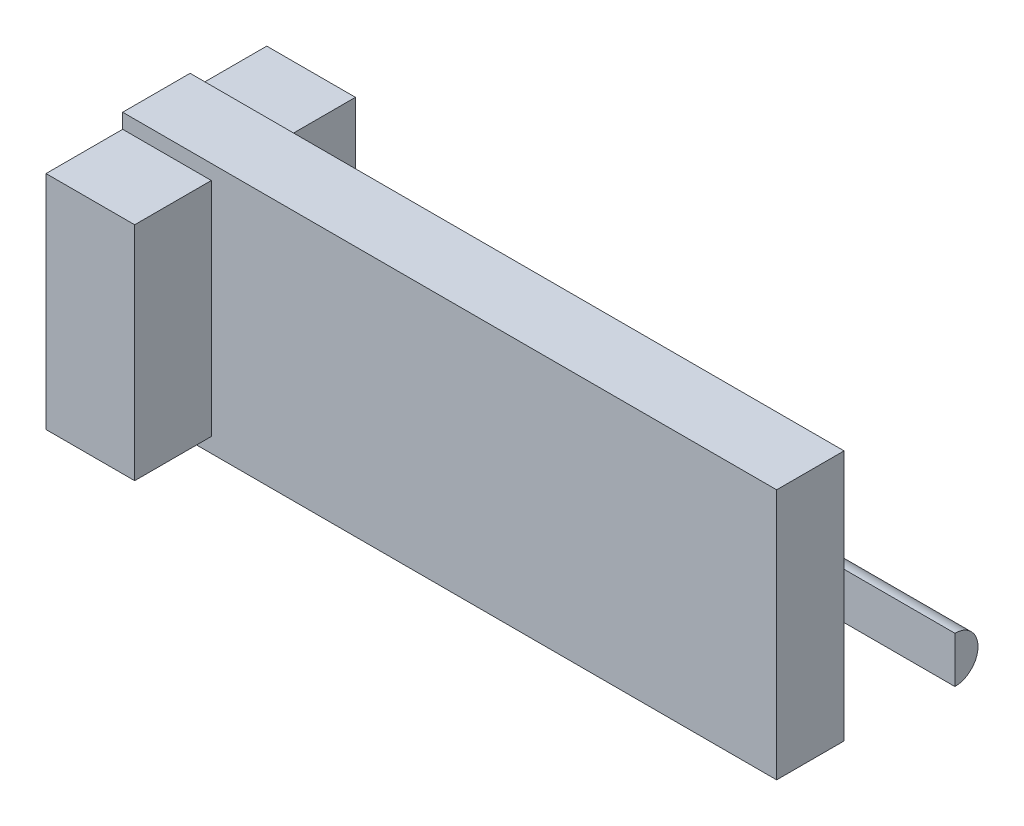
ISO-10303-21;
HEADER;
FILE_DESCRIPTION(('STEP AP214'),'2;1');
FILE_NAME('part.step','',(''),(''),'','','');
FILE_SCHEMA(('AUTOMOTIVE_DESIGN { 1 0 10303 214 1 1 1 1 }'));
ENDSEC;
DATA;
#1=APPLICATION_CONTEXT('core data for automotive mechanical design processes');
#2=APPLICATION_PROTOCOL_DEFINITION('international standard','automotive_design',2000,#1);
#3=PRODUCT_CONTEXT('',#1,'mechanical');
#4=PRODUCT('Part','Part','',(#3));
#5=PRODUCT_RELATED_PRODUCT_CATEGORY('part','',(#4));
#6=PRODUCT_DEFINITION_FORMATION('','',#4);
#7=PRODUCT_DEFINITION_CONTEXT('part definition',#1,'design');
#8=PRODUCT_DEFINITION('design','',#6,#7);
#9=PRODUCT_DEFINITION_SHAPE('','',#8);
#10=(LENGTH_UNIT() NAMED_UNIT(*) SI_UNIT(.MILLI.,.METRE.));
#11=(NAMED_UNIT(*) PLANE_ANGLE_UNIT() SI_UNIT($,.RADIAN.));
#12=(NAMED_UNIT(*) SI_UNIT($,.STERADIAN.) SOLID_ANGLE_UNIT());
#13=UNCERTAINTY_MEASURE_WITH_UNIT(LENGTH_MEASURE(1.E-05),#10,'distance_accuracy_value','');
#14=(GEOMETRIC_REPRESENTATION_CONTEXT(3) GLOBAL_UNCERTAINTY_ASSIGNED_CONTEXT((#13)) GLOBAL_UNIT_ASSIGNED_CONTEXT((#10,
#11,#12)) REPRESENTATION_CONTEXT('',''));
#15=CARTESIAN_POINT('',(0.,0.,0.));
#16=DIRECTION('',(0.,0.,1.));
#17=DIRECTION('',(1.,0.,0.));
#18=AXIS2_PLACEMENT_3D('',#15,#16,#17);
#19=CARTESIAN_POINT('',(0.,0.,-1.825));
#20=DIRECTION('',(0.,0.,1.));
#21=DIRECTION('',(1.,0.,0.));
#22=AXIS2_PLACEMENT_3D('',#19,#20,#21);
#23=PLANE('',#22);
#24=DIRECTION('',(0.,1.,0.));
#25=VECTOR('',#24,1.);
#26=CARTESIAN_POINT('',(11.7,0.,-1.825));
#27=LINE('',#26,#25);
#28=CARTESIAN_POINT('',(11.7,-1.25,-1.82499999999999));
#29=VERTEX_POINT('',#28);
#30=CARTESIAN_POINT('',(11.7,1.25,-1.825));
#31=VERTEX_POINT('',#30);
#32=EDGE_CURVE('E152',#29,#31,#27,.T.);
#33=ORIENTED_EDGE('',*,*,#32,.F.);
#34=DIRECTION('',(-1.,0.,0.));
#35=VECTOR('',#34,1.);
#36=CARTESIAN_POINT('',(0.,-1.25,-1.82499999999999));
#37=LINE('',#36,#35);
#38=CARTESIAN_POINT('',(17.7,-1.25,-1.82499999999999));
#39=VERTEX_POINT('',#38);
#40=EDGE_CURVE('E165',#39,#29,#37,.T.);
#41=ORIENTED_EDGE('',*,*,#40,.F.);
#42=DIRECTION('',(0.,1.,0.));
#43=VECTOR('',#42,1.);
#44=CARTESIAN_POINT('',(17.7,6.8,-1.825));
#45=LINE('',#44,#43);
#46=CARTESIAN_POINT('',(17.7,-6.8,-1.825));
#47=VERTEX_POINT('',#46);
#48=EDGE_CURVE('E240',#47,#39,#45,.T.);
#49=ORIENTED_EDGE('',*,*,#48,.F.);
#50=DIRECTION('',(1.,0.,0.));
#51=VECTOR('',#50,1.);
#52=CARTESIAN_POINT('',(-17.7,-6.8,-1.825));
#53=LINE('',#52,#51);
#54=CARTESIAN_POINT('',(-17.7,-6.8,-1.825));
#55=VERTEX_POINT('',#54);
#56=EDGE_CURVE('E232',#55,#47,#53,.T.);
#57=ORIENTED_EDGE('',*,*,#56,.F.);
#58=DIRECTION('',(0.,-1.,0.));
#59=VECTOR('',#58,1.);
#60=CARTESIAN_POINT('',(-17.7,6.8,-1.825));
#61=LINE('',#60,#59);
#62=CARTESIAN_POINT('',(-17.7,-6.,-1.825));
#63=VERTEX_POINT('',#62);
#64=EDGE_CURVE('E246',#63,#55,#61,.T.);
#65=ORIENTED_EDGE('',*,*,#64,.F.);
#66=DIRECTION('',(-1.,0.,0.));
#67=VECTOR('',#66,1.);
#68=CARTESIAN_POINT('',(-12.9,-6.,-1.825));
#69=LINE('',#68,#67);
#70=CARTESIAN_POINT('',(-12.9,-6.,-1.825));
#71=VERTEX_POINT('',#70);
#72=EDGE_CURVE('E63',#71,#63,#69,.T.);
#73=ORIENTED_EDGE('',*,*,#72,.F.);
#74=DIRECTION('',(0.,-1.,0.));
#75=VECTOR('',#74,1.);
#76=CARTESIAN_POINT('',(-12.9,6.,-1.825));
#77=LINE('',#76,#75);
#78=CARTESIAN_POINT('',(-12.9,6.,-1.825));
#79=VERTEX_POINT('',#78);
#80=EDGE_CURVE('E183',#79,#71,#77,.T.);
#81=ORIENTED_EDGE('',*,*,#80,.F.);
#82=DIRECTION('',(1.,0.,0.));
#83=VECTOR('',#82,1.);
#84=CARTESIAN_POINT('',(-17.7,6.,-1.825));
#85=LINE('',#84,#83);
#86=CARTESIAN_POINT('',(-17.7,6.,-1.825));
#87=VERTEX_POINT('',#86);
#88=EDGE_CURVE('E157',#87,#79,#85,.T.);
#89=ORIENTED_EDGE('',*,*,#88,.F.);
#90=CARTESIAN_POINT('',(-17.7,6.8,-1.825));
#91=VERTEX_POINT('',#90);
#92=EDGE_CURVE('E247',#91,#87,#61,.T.);
#93=ORIENTED_EDGE('',*,*,#92,.F.);
#94=DIRECTION('',(-1.,0.,0.));
#95=VECTOR('',#94,1.);
#96=CARTESIAN_POINT('',(-17.7,6.8,-1.825));
#97=LINE('',#96,#95);
#98=CARTESIAN_POINT('',(17.7,6.8,-1.825));
#99=VERTEX_POINT('',#98);
#100=EDGE_CURVE('E243',#99,#91,#97,.T.);
#101=ORIENTED_EDGE('',*,*,#100,.F.);
#102=CARTESIAN_POINT('',(17.7,1.25,-1.825));
#103=VERTEX_POINT('',#102);
#104=EDGE_CURVE('E227',#103,#99,#45,.T.);
#105=ORIENTED_EDGE('',*,*,#104,.F.);
#106=DIRECTION('',(-1.,0.,0.));
#107=VECTOR('',#106,1.);
#108=CARTESIAN_POINT('',(0.,1.25,-1.825));
#109=LINE('',#108,#107);
#110=EDGE_CURVE('E163',#103,#31,#109,.T.);
#111=ORIENTED_EDGE('',*,*,#110,.T.);
#112=EDGE_LOOP('',(#33,#41,#49,#57,#65,#73,#81,#89,#93,#101,#105,#111));
#113=FACE_BOUND('',#112,.T.);
#114=ADVANCED_FACE('F40',(#113),#23,.F.);
#115=CARTESIAN_POINT('',(17.7,6.8,1.825));
#116=DIRECTION('',(-1.,0.,0.));
#117=DIRECTION('',(0.,0.,1.));
#118=AXIS2_PLACEMENT_3D('',#115,#116,#117);
#119=PLANE('',#118);
#120=ORIENTED_EDGE('',*,*,#48,.T.);
#121=EDGE_CURVE('E244',#39,#103,#45,.T.);
#122=ORIENTED_EDGE('',*,*,#121,.T.);
#123=ORIENTED_EDGE('',*,*,#104,.T.);
#124=DIRECTION('',(0.,0.,-1.));
#125=VECTOR('',#124,1.);
#126=CARTESIAN_POINT('',(17.7,6.8,1.825));
#127=LINE('',#126,#125);
#128=CARTESIAN_POINT('',(17.7,6.8,1.825));
#129=VERTEX_POINT('',#128);
#130=EDGE_CURVE('E11',#129,#99,#127,.T.);
#131=ORIENTED_EDGE('',*,*,#130,.F.);
#132=DIRECTION('',(0.,1.,0.));
#133=VECTOR('',#132,1.);
#134=CARTESIAN_POINT('',(17.7,6.8,1.825));
#135=LINE('',#134,#133);
#136=CARTESIAN_POINT('',(17.7,-6.8,1.825));
#137=VERTEX_POINT('',#136);
#138=EDGE_CURVE('E228',#137,#129,#135,.T.);
#139=ORIENTED_EDGE('',*,*,#138,.F.);
#140=DIRECTION('',(0.,0.,-1.));
#141=VECTOR('',#140,1.);
#142=CARTESIAN_POINT('',(17.7,-6.8,1.825));
#143=LINE('',#142,#141);
#144=EDGE_CURVE('E239',#137,#47,#143,.T.);
#145=ORIENTED_EDGE('',*,*,#144,.T.);
#146=EDGE_LOOP('',(#120,#122,#123,#131,#139,#145));
#147=FACE_BOUND('',#146,.T.);
#148=ADVANCED_FACE('F42',(#147),#119,.F.);
#149=CARTESIAN_POINT('',(-17.7,6.8,1.825));
#150=DIRECTION('',(0.,-1.,0.));
#151=DIRECTION('',(0.,0.,-1.));
#152=AXIS2_PLACEMENT_3D('',#149,#150,#151);
#153=PLANE('',#152);
#154=ORIENTED_EDGE('',*,*,#100,.T.);
#155=DIRECTION('',(0.,0.,-1.));
#156=VECTOR('',#155,1.);
#157=CARTESIAN_POINT('',(-17.7,6.8,1.825));
#158=LINE('',#157,#156);
#159=CARTESIAN_POINT('',(-17.7,6.8,1.825));
#160=VERTEX_POINT('',#159);
#161=EDGE_CURVE('E48',#160,#91,#158,.T.);
#162=ORIENTED_EDGE('',*,*,#161,.F.);
#163=DIRECTION('',(-1.,0.,0.));
#164=VECTOR('',#163,1.);
#165=CARTESIAN_POINT('',(-17.7,6.8,1.825));
#166=LINE('',#165,#164);
#167=EDGE_CURVE('E231',#129,#160,#166,.T.);
#168=ORIENTED_EDGE('',*,*,#167,.F.);
#169=ORIENTED_EDGE('',*,*,#130,.T.);
#170=EDGE_LOOP('',(#154,#162,#168,#169));
#171=FACE_BOUND('',#170,.T.);
#172=ADVANCED_FACE('F293',(#171),#153,.F.);
#173=CARTESIAN_POINT('',(-17.7,6.8,1.825));
#174=DIRECTION('',(1.,0.,0.));
#175=DIRECTION('',(0.,0.,-1.));
#176=AXIS2_PLACEMENT_3D('',#173,#174,#175);
#177=PLANE('',#176);
#178=ORIENTED_EDGE('',*,*,#92,.T.);
#179=DIRECTION('',(0.,0.,1.));
#180=VECTOR('',#179,1.);
#181=CARTESIAN_POINT('',(-17.7,6.,-5.975));
#182=LINE('',#181,#180);
#183=CARTESIAN_POINT('',(-17.7,6.,-5.975));
#184=VERTEX_POINT('',#183);
#185=EDGE_CURVE('E194',#184,#87,#182,.T.);
#186=ORIENTED_EDGE('',*,*,#185,.F.);
#187=DIRECTION('',(0.,1.,0.));
#188=VECTOR('',#187,1.);
#189=CARTESIAN_POINT('',(-17.7,-6.,-5.975));
#190=LINE('',#189,#188);
#191=CARTESIAN_POINT('',(-17.7,-6.,-5.975));
#192=VERTEX_POINT('',#191);
#193=EDGE_CURVE('E171',#192,#184,#190,.T.);
#194=ORIENTED_EDGE('',*,*,#193,.F.);
#195=DIRECTION('',(0.,0.,1.));
#196=VECTOR('',#195,1.);
#197=CARTESIAN_POINT('',(-17.7,-6.,-5.975));
#198=LINE('',#197,#196);
#199=EDGE_CURVE('E180',#192,#63,#198,.T.);
#200=ORIENTED_EDGE('',*,*,#199,.T.);
#201=ORIENTED_EDGE('',*,*,#64,.T.);
#202=DIRECTION('',(0.,0.,-1.));
#203=VECTOR('',#202,1.);
#204=CARTESIAN_POINT('',(-17.7,-6.8,1.825));
#205=LINE('',#204,#203);
#206=CARTESIAN_POINT('',(-17.7,-6.8,1.825));
#207=VERTEX_POINT('',#206);
#208=EDGE_CURVE('E253',#207,#55,#205,.T.);
#209=ORIENTED_EDGE('',*,*,#208,.F.);
#210=DIRECTION('',(0.,-1.,0.));
#211=VECTOR('',#210,1.);
#212=CARTESIAN_POINT('',(-17.7,6.8,1.825));
#213=LINE('',#212,#211);
#214=CARTESIAN_POINT('',(-17.7,-6.,1.825));
#215=VERTEX_POINT('',#214);
#216=EDGE_CURVE('E234',#215,#207,#213,.T.);
#217=ORIENTED_EDGE('',*,*,#216,.F.);
#218=DIRECTION('',(0.,0.,-1.));
#219=VECTOR('',#218,1.);
#220=CARTESIAN_POINT('',(-17.7,-6.,5.975));
#221=LINE('',#220,#219);
#222=CARTESIAN_POINT('',(-17.7,-6.,5.975));
#223=VERTEX_POINT('',#222);
#224=EDGE_CURVE('E218',#223,#215,#221,.T.);
#225=ORIENTED_EDGE('',*,*,#224,.F.);
#226=DIRECTION('',(0.,-1.,0.));
#227=VECTOR('',#226,1.);
#228=CARTESIAN_POINT('',(-17.7,6.,5.975));
#229=LINE('',#228,#227);
#230=CARTESIAN_POINT('',(-17.7,6.,5.975));
#231=VERTEX_POINT('',#230);
#232=EDGE_CURVE('E204',#231,#223,#229,.T.);
#233=ORIENTED_EDGE('',*,*,#232,.F.);
#234=DIRECTION('',(0.,0.,-1.));
#235=VECTOR('',#234,1.);
#236=CARTESIAN_POINT('',(-17.7,6.,5.975));
#237=LINE('',#236,#235);
#238=CARTESIAN_POINT('',(-17.7,6.,1.825));
#239=VERTEX_POINT('',#238);
#240=EDGE_CURVE('E221',#231,#239,#237,.T.);
#241=ORIENTED_EDGE('',*,*,#240,.T.);
#242=EDGE_CURVE('E235',#160,#239,#213,.T.);
#243=ORIENTED_EDGE('',*,*,#242,.F.);
#244=ORIENTED_EDGE('',*,*,#161,.T.);
#245=EDGE_LOOP('',(#178,#186,#194,#200,#201,#209,#217,#225,#233,#241,#243,#244));
#246=FACE_BOUND('',#245,.T.);
#247=ADVANCED_FACE('F260',(#246),#177,.F.);
#248=CARTESIAN_POINT('',(-17.7,-6.8,1.825));
#249=DIRECTION('',(0.,1.,0.));
#250=DIRECTION('',(0.,0.,1.));
#251=AXIS2_PLACEMENT_3D('',#248,#249,#250);
#252=PLANE('',#251);
#253=ORIENTED_EDGE('',*,*,#56,.T.);
#254=ORIENTED_EDGE('',*,*,#144,.F.);
#255=DIRECTION('',(1.,0.,0.));
#256=VECTOR('',#255,1.);
#257=CARTESIAN_POINT('',(-17.7,-6.8,1.825));
#258=LINE('',#257,#256);
#259=EDGE_CURVE('E237',#207,#137,#258,.T.);
#260=ORIENTED_EDGE('',*,*,#259,.F.);
#261=ORIENTED_EDGE('',*,*,#208,.T.);
#262=EDGE_LOOP('',(#253,#254,#260,#261));
#263=FACE_BOUND('',#262,.T.);
#264=ADVANCED_FACE('F299',(#263),#252,.F.);
#265=CARTESIAN_POINT('',(0.,0.,1.825));
#266=DIRECTION('',(0.,0.,1.));
#267=DIRECTION('',(1.,0.,0.));
#268=AXIS2_PLACEMENT_3D('',#265,#266,#267);
#269=PLANE('',#268);
#270=DIRECTION('',(1.,0.,0.));
#271=VECTOR('',#270,1.);
#272=CARTESIAN_POINT('',(-17.7,-6.,1.825));
#273=LINE('',#272,#271);
#274=CARTESIAN_POINT('',(-12.9,-6.,1.825));
#275=VERTEX_POINT('',#274);
#276=EDGE_CURVE('E202',#215,#275,#273,.T.);
#277=ORIENTED_EDGE('',*,*,#276,.F.);
#278=ORIENTED_EDGE('',*,*,#216,.T.);
#279=ORIENTED_EDGE('',*,*,#259,.T.);
#280=ORIENTED_EDGE('',*,*,#138,.T.);
#281=ORIENTED_EDGE('',*,*,#167,.T.);
#282=ORIENTED_EDGE('',*,*,#242,.T.);
#283=DIRECTION('',(-1.,0.,0.));
#284=VECTOR('',#283,1.);
#285=CARTESIAN_POINT('',(-17.7,6.,1.825));
#286=LINE('',#285,#284);
#287=CARTESIAN_POINT('',(-12.9,6.,1.825));
#288=VERTEX_POINT('',#287);
#289=EDGE_CURVE('E211',#288,#239,#286,.T.);
#290=ORIENTED_EDGE('',*,*,#289,.F.);
#291=DIRECTION('',(0.,1.,0.));
#292=VECTOR('',#291,1.);
#293=CARTESIAN_POINT('',(-12.9,6.,1.825));
#294=LINE('',#293,#292);
#295=EDGE_CURVE('E197',#275,#288,#294,.T.);
#296=ORIENTED_EDGE('',*,*,#295,.F.);
#297=EDGE_LOOP('',(#277,#278,#279,#280,#281,#282,#290,#296));
#298=FACE_BOUND('',#297,.T.);
#299=ADVANCED_FACE('F297',(#298),#269,.T.);
#300=CARTESIAN_POINT('',(-12.9,6.,5.975));
#301=DIRECTION('',(-1.,0.,0.));
#302=DIRECTION('',(0.,-1.,0.));
#303=AXIS2_PLACEMENT_3D('',#300,#301,#302);
#304=PLANE('',#303);
#305=ORIENTED_EDGE('',*,*,#295,.T.);
#306=DIRECTION('',(0.,0.,-1.));
#307=VECTOR('',#306,1.);
#308=CARTESIAN_POINT('',(-12.9,6.,5.975));
#309=LINE('',#308,#307);
#310=CARTESIAN_POINT('',(-12.9,6.,5.975));
#311=VERTEX_POINT('',#310);
#312=EDGE_CURVE('E224',#311,#288,#309,.T.);
#313=ORIENTED_EDGE('',*,*,#312,.F.);
#314=DIRECTION('',(0.,1.,0.));
#315=VECTOR('',#314,1.);
#316=CARTESIAN_POINT('',(-12.9,6.,5.975));
#317=LINE('',#316,#315);
#318=CARTESIAN_POINT('',(-12.9,-6.,5.975));
#319=VERTEX_POINT('',#318);
#320=EDGE_CURVE('E198',#319,#311,#317,.T.);
#321=ORIENTED_EDGE('',*,*,#320,.F.);
#322=DIRECTION('',(0.,0.,-1.));
#323=VECTOR('',#322,1.);
#324=CARTESIAN_POINT('',(-12.9,-6.,5.975));
#325=LINE('',#324,#323);
#326=EDGE_CURVE('E208',#319,#275,#325,.T.);
#327=ORIENTED_EDGE('',*,*,#326,.T.);
#328=EDGE_LOOP('',(#305,#313,#321,#327));
#329=FACE_BOUND('',#328,.T.);
#330=ADVANCED_FACE('F418',(#329),#304,.F.);
#331=CARTESIAN_POINT('',(-17.7,6.,5.975));
#332=DIRECTION('',(0.,-1.,0.));
#333=DIRECTION('',(0.,0.,-1.));
#334=AXIS2_PLACEMENT_3D('',#331,#332,#333);
#335=PLANE('',#334);
#336=ORIENTED_EDGE('',*,*,#289,.T.);
#337=ORIENTED_EDGE('',*,*,#240,.F.);
#338=DIRECTION('',(-1.,0.,0.));
#339=VECTOR('',#338,1.);
#340=CARTESIAN_POINT('',(-17.7,6.,5.975));
#341=LINE('',#340,#339);
#342=EDGE_CURVE('E201',#311,#231,#341,.T.);
#343=ORIENTED_EDGE('',*,*,#342,.F.);
#344=ORIENTED_EDGE('',*,*,#312,.T.);
#345=EDGE_LOOP('',(#336,#337,#343,#344));
#346=FACE_BOUND('',#345,.T.);
#347=ADVANCED_FACE('F410',(#346),#335,.F.);
#348=CARTESIAN_POINT('',(-17.7,-6.,5.975));
#349=DIRECTION('',(0.,1.,0.));
#350=DIRECTION('',(0.,0.,1.));
#351=AXIS2_PLACEMENT_3D('',#348,#349,#350);
#352=PLANE('',#351);
#353=ORIENTED_EDGE('',*,*,#276,.T.);
#354=ORIENTED_EDGE('',*,*,#326,.F.);
#355=DIRECTION('',(1.,0.,0.));
#356=VECTOR('',#355,1.);
#357=CARTESIAN_POINT('',(-17.7,-6.,5.975));
#358=LINE('',#357,#356);
#359=EDGE_CURVE('E206',#223,#319,#358,.T.);
#360=ORIENTED_EDGE('',*,*,#359,.F.);
#361=ORIENTED_EDGE('',*,*,#224,.T.);
#362=EDGE_LOOP('',(#353,#354,#360,#361));
#363=FACE_BOUND('',#362,.T.);
#364=ADVANCED_FACE('F401',(#363),#352,.F.);
#365=CARTESIAN_POINT('',(0.,0.,5.975));
#366=DIRECTION('',(0.,0.,1.));
#367=DIRECTION('',(1.,0.,0.));
#368=AXIS2_PLACEMENT_3D('',#365,#366,#367);
#369=PLANE('',#368);
#370=ORIENTED_EDGE('',*,*,#320,.T.);
#371=ORIENTED_EDGE('',*,*,#342,.T.);
#372=ORIENTED_EDGE('',*,*,#232,.T.);
#373=ORIENTED_EDGE('',*,*,#359,.T.);
#374=EDGE_LOOP('',(#370,#371,#372,#373));
#375=FACE_BOUND('',#374,.T.);
#376=ADVANCED_FACE('F378',(#375),#369,.T.);
#377=CARTESIAN_POINT('',(-17.7,6.,-5.975));
#378=DIRECTION('',(0.,-1.,0.));
#379=DIRECTION('',(0.,0.,-1.));
#380=AXIS2_PLACEMENT_3D('',#377,#378,#379);
#381=PLANE('',#380);
#382=ORIENTED_EDGE('',*,*,#88,.T.);
#383=DIRECTION('',(0.,0.,1.));
#384=VECTOR('',#383,1.);
#385=CARTESIAN_POINT('',(-12.9,6.,-5.975));
#386=LINE('',#385,#384);
#387=CARTESIAN_POINT('',(-12.9,6.,-5.975));
#388=VERTEX_POINT('',#387);
#389=EDGE_CURVE('E191',#388,#79,#386,.T.);
#390=ORIENTED_EDGE('',*,*,#389,.F.);
#391=DIRECTION('',(1.,0.,0.));
#392=VECTOR('',#391,1.);
#393=CARTESIAN_POINT('',(-17.7,6.,-5.975));
#394=LINE('',#393,#392);
#395=EDGE_CURVE('E174',#184,#388,#394,.T.);
#396=ORIENTED_EDGE('',*,*,#395,.F.);
#397=ORIENTED_EDGE('',*,*,#185,.T.);
#398=EDGE_LOOP('',(#382,#390,#396,#397));
#399=FACE_BOUND('',#398,.T.);
#400=ADVANCED_FACE('F267',(#399),#381,.F.);
#401=CARTESIAN_POINT('',(-12.9,6.,-5.975));
#402=DIRECTION('',(-1.,0.,0.));
#403=DIRECTION('',(0.,-1.,0.));
#404=AXIS2_PLACEMENT_3D('',#401,#402,#403);
#405=PLANE('',#404);
#406=ORIENTED_EDGE('',*,*,#80,.T.);
#407=DIRECTION('',(0.,0.,1.));
#408=VECTOR('',#407,1.);
#409=CARTESIAN_POINT('',(-12.9,-6.,-5.975));
#410=LINE('',#409,#408);
#411=CARTESIAN_POINT('',(-12.9,-6.,-5.975));
#412=VERTEX_POINT('',#411);
#413=EDGE_CURVE('E188',#412,#71,#410,.T.);
#414=ORIENTED_EDGE('',*,*,#413,.F.);
#415=DIRECTION('',(0.,-1.,0.));
#416=VECTOR('',#415,1.);
#417=CARTESIAN_POINT('',(-12.9,6.,-5.975));
#418=LINE('',#417,#416);
#419=EDGE_CURVE('E176',#388,#412,#418,.T.);
#420=ORIENTED_EDGE('',*,*,#419,.F.);
#421=ORIENTED_EDGE('',*,*,#389,.T.);
#422=EDGE_LOOP('',(#406,#414,#420,#421));
#423=FACE_BOUND('',#422,.T.);
#424=ADVANCED_FACE('F270',(#423),#405,.F.);
#425=CARTESIAN_POINT('',(-12.9,-6.,-5.975));
#426=DIRECTION('',(0.,1.,0.));
#427=DIRECTION('',(0.,0.,1.));
#428=AXIS2_PLACEMENT_3D('',#425,#426,#427);
#429=PLANE('',#428);
#430=ORIENTED_EDGE('',*,*,#72,.T.);
#431=ORIENTED_EDGE('',*,*,#199,.F.);
#432=DIRECTION('',(-1.,0.,0.));
#433=VECTOR('',#432,1.);
#434=CARTESIAN_POINT('',(-12.9,-6.,-5.975));
#435=LINE('',#434,#433);
#436=EDGE_CURVE('E178',#412,#192,#435,.T.);
#437=ORIENTED_EDGE('',*,*,#436,.F.);
#438=ORIENTED_EDGE('',*,*,#413,.T.);
#439=EDGE_LOOP('',(#430,#431,#437,#438));
#440=FACE_BOUND('',#439,.T.);
#441=ADVANCED_FACE('F279',(#440),#429,.F.);
#442=CARTESIAN_POINT('',(0.,0.,-5.975));
#443=DIRECTION('',(0.,0.,-1.));
#444=DIRECTION('',(-1.,0.,0.));
#445=AXIS2_PLACEMENT_3D('',#442,#443,#444);
#446=PLANE('',#445);
#447=ORIENTED_EDGE('',*,*,#193,.T.);
#448=ORIENTED_EDGE('',*,*,#395,.T.);
#449=ORIENTED_EDGE('',*,*,#419,.T.);
#450=ORIENTED_EDGE('',*,*,#436,.T.);
#451=EDGE_LOOP('',(#447,#448,#449,#450));
#452=FACE_BOUND('',#451,.T.);
#453=ADVANCED_FACE('F274',(#452),#446,.T.);
#454=CARTESIAN_POINT('',(0.,0.,-1.825));
#455=DIRECTION('',(0.,0.,1.));
#456=DIRECTION('',(-1.,0.,0.));
#457=AXIS2_PLACEMENT_3D('',#454,#455,#456);
#458=PLANE('',#457);
#459=ORIENTED_EDGE('',*,*,#121,.F.);
#460=CARTESIAN_POINT('',(23.7,-1.25,-1.82499999999999));
#461=VERTEX_POINT('',#460);
#462=EDGE_CURVE('E150',#461,#39,#37,.T.);
#463=ORIENTED_EDGE('',*,*,#462,.F.);
#464=DIRECTION('',(0.,1.,0.));
#465=VECTOR('',#464,1.);
#466=CARTESIAN_POINT('',(23.7,0.,-1.825));
#467=LINE('',#466,#465);
#468=CARTESIAN_POINT('',(23.7,1.25,-1.825));
#469=VERTEX_POINT('',#468);
#470=EDGE_CURVE('E146',#461,#469,#467,.T.);
#471=ORIENTED_EDGE('',*,*,#470,.T.);
#472=EDGE_CURVE('E55',#469,#103,#109,.T.);
#473=ORIENTED_EDGE('',*,*,#472,.T.);
#474=EDGE_LOOP('',(#459,#463,#471,#473));
#475=FACE_BOUND('',#474,.T.);
#476=ADVANCED_FACE('F148',(#475),#458,.T.);
#477=CARTESIAN_POINT('',(11.7,0.,-1.825));
#478=DIRECTION('',(1.,0.,0.));
#479=DIRECTION('',(0.,0.,-1.));
#480=AXIS2_PLACEMENT_3D('',#477,#478,#479);
#481=CYLINDRICAL_SURFACE('',#480,1.25);
#482=CARTESIAN_POINT('',(23.7,0.,-1.825));
#483=DIRECTION('',(1.,0.,0.));
#484=DIRECTION('',(0.,0.,-1.));
#485=AXIS2_PLACEMENT_3D('',#482,#483,#484);
#486=CIRCLE('',#485,1.25);
#487=EDGE_CURVE('E154',#461,#469,#486,.T.);
#488=ORIENTED_EDGE('',*,*,#487,.F.);
#489=ORIENTED_EDGE('',*,*,#462,.T.);
#490=ORIENTED_EDGE('',*,*,#40,.T.);
#491=CARTESIAN_POINT('',(11.7,0.,-1.825));
#492=DIRECTION('',(1.,0.,0.));
#493=DIRECTION('',(0.,0.,-1.));
#494=AXIS2_PLACEMENT_3D('',#491,#492,#493);
#495=CIRCLE('',#494,1.25);
#496=EDGE_CURVE('E158',#29,#31,#495,.T.);
#497=ORIENTED_EDGE('',*,*,#496,.T.);
#498=ORIENTED_EDGE('',*,*,#110,.F.);
#499=ORIENTED_EDGE('',*,*,#472,.F.);
#500=EDGE_LOOP('',(#488,#489,#490,#497,#498,#499));
#501=FACE_BOUND('',#500,.T.);
#502=ADVANCED_FACE('F160',(#501),#481,.T.);
#503=CARTESIAN_POINT('',(23.7,0.,-1.825));
#504=DIRECTION('',(-1.,0.,0.));
#505=DIRECTION('',(0.,0.,1.));
#506=AXIS2_PLACEMENT_3D('',#503,#504,#505);
#507=PLANE('',#506);
#508=ORIENTED_EDGE('',*,*,#487,.T.);
#509=ORIENTED_EDGE('',*,*,#470,.F.);
#510=EDGE_LOOP('',(#508,#509));
#511=FACE_BOUND('',#510,.T.);
#512=ADVANCED_FACE('F155',(#511),#507,.F.);
#513=CARTESIAN_POINT('',(11.7,0.,-1.825));
#514=DIRECTION('',(-1.,0.,0.));
#515=DIRECTION('',(0.,0.,1.));
#516=AXIS2_PLACEMENT_3D('',#513,#514,#515);
#517=PLANE('',#516);
#518=ORIENTED_EDGE('',*,*,#32,.T.);
#519=ORIENTED_EDGE('',*,*,#496,.F.);
#520=EDGE_LOOP('',(#518,#519));
#521=FACE_BOUND('',#520,.T.);
#522=ADVANCED_FACE('F314',(#521),#517,.T.);
#523=CLOSED_SHELL('',(#114,#148,#172,#247,#264,#299,#330,#347,#364,#376,#400,#424,#441,#453,
#476,#502,#512,#522));
#524=MANIFOLD_SOLID_BREP('B2',#523);
#525=ADVANCED_BREP_SHAPE_REPRESENTATION('',(#18,#524),#14);
#526=SHAPE_DEFINITION_REPRESENTATION(#9,#525);
ENDSEC;
END-ISO-10303-21;
